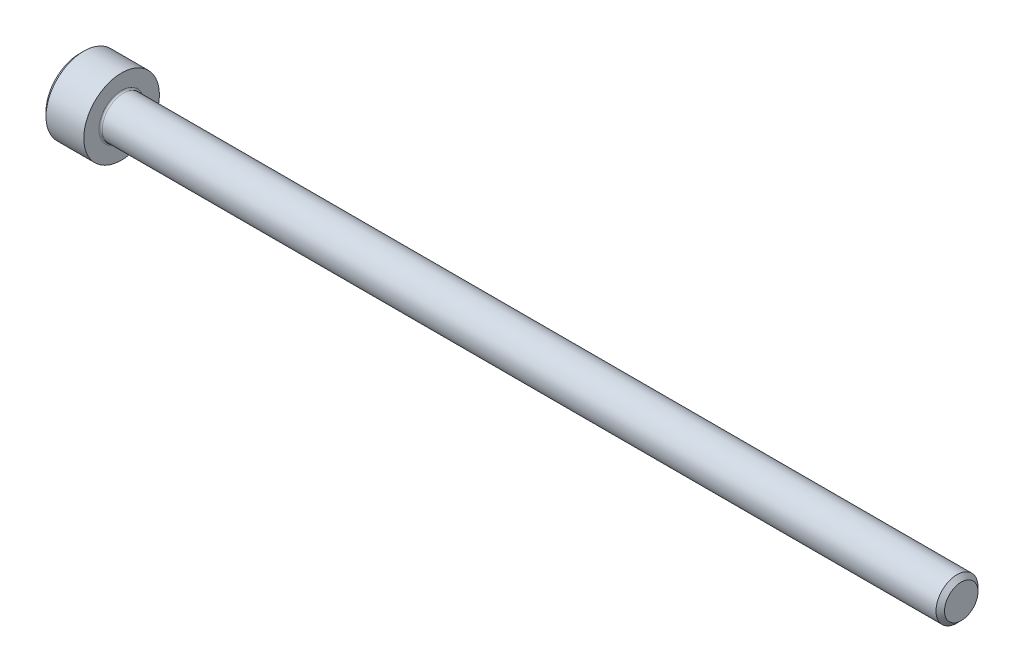
ISO-10303-21;
HEADER;
FILE_DESCRIPTION(('STEP AP214'),'2;1');
FILE_NAME('part.step','',(''),(''),'','','');
FILE_SCHEMA(('AUTOMOTIVE_DESIGN { 1 0 10303 214 1 1 1 1 }'));
ENDSEC;
DATA;
#1=APPLICATION_CONTEXT('core data for automotive mechanical design processes');
#2=APPLICATION_PROTOCOL_DEFINITION('international standard','automotive_design',2000,#1);
#3=PRODUCT_CONTEXT('',#1,'mechanical');
#4=PRODUCT('Part','Part','',(#3));
#5=PRODUCT_RELATED_PRODUCT_CATEGORY('part','',(#4));
#6=PRODUCT_DEFINITION_FORMATION('','',#4);
#7=PRODUCT_DEFINITION_CONTEXT('part definition',#1,'design');
#8=PRODUCT_DEFINITION('design','',#6,#7);
#9=PRODUCT_DEFINITION_SHAPE('','',#8);
#10=(LENGTH_UNIT() NAMED_UNIT(*) SI_UNIT(.MILLI.,.METRE.));
#11=(NAMED_UNIT(*) PLANE_ANGLE_UNIT() SI_UNIT($,.RADIAN.));
#12=(NAMED_UNIT(*) SI_UNIT($,.STERADIAN.) SOLID_ANGLE_UNIT());
#13=UNCERTAINTY_MEASURE_WITH_UNIT(LENGTH_MEASURE(1.E-05),#10,'distance_accuracy_value','');
#14=(GEOMETRIC_REPRESENTATION_CONTEXT(3) GLOBAL_UNCERTAINTY_ASSIGNED_CONTEXT((#13)) GLOBAL_UNIT_ASSIGNED_CONTEXT((#10,
#11,#12)) REPRESENTATION_CONTEXT('',''));
#15=CARTESIAN_POINT('',(0.,0.,0.));
#16=DIRECTION('',(0.,0.,1.));
#17=DIRECTION('',(1.,0.,0.));
#18=AXIS2_PLACEMENT_3D('',#15,#16,#17);
#19=CARTESIAN_POINT('',(0.,0.,0.));
#20=DIRECTION('',(-1.,0.,0.));
#21=DIRECTION('',(0.,0.,1.));
#22=AXIS2_PLACEMENT_3D('',#19,#20,#21);
#23=PLANE('',#22);
#24=DIRECTION('',(0.,-0.5,0.866025403784439));
#25=VECTOR('',#24,1.);
#26=CARTESIAN_POINT('',(0.,1.18068130049278,0.));
#27=LINE('',#26,#25);
#28=CARTESIAN_POINT('',(0.,1.18068130049278,0.));
#29=VERTEX_POINT('',#28);
#30=CARTESIAN_POINT('',(0.,0.590340650246392,1.0225));
#31=VERTEX_POINT('',#30);
#32=EDGE_CURVE('E266',#29,#31,#27,.T.);
#33=ORIENTED_EDGE('',*,*,#32,.T.);
#34=DIRECTION('',(0.,1.,0.));
#35=VECTOR('',#34,1.);
#36=CARTESIAN_POINT('',(0.,-0.590340650246393,1.0225));
#37=LINE('',#36,#35);
#38=CARTESIAN_POINT('',(0.,-0.590340650246393,1.0225));
#39=VERTEX_POINT('',#38);
#40=EDGE_CURVE('E137',#39,#31,#37,.T.);
#41=ORIENTED_EDGE('',*,*,#40,.F.);
#42=DIRECTION('',(0.,-0.500000000000001,-0.866025403784438));
#43=VECTOR('',#42,1.);
#44=CARTESIAN_POINT('',(0.,-0.590340650246393,1.0225));
#45=LINE('',#44,#43);
#46=CARTESIAN_POINT('',(0.,-1.18068130049279,0.));
#47=VERTEX_POINT('',#46);
#48=EDGE_CURVE('E269',#39,#47,#45,.T.);
#49=ORIENTED_EDGE('',*,*,#48,.T.);
#50=DIRECTION('',(0.,0.5,-0.866025403784439));
#51=VECTOR('',#50,1.);
#52=CARTESIAN_POINT('',(0.,-1.18068130049279,0.));
#53=LINE('',#52,#51);
#54=CARTESIAN_POINT('',(0.,-0.590340650246394,-1.0225));
#55=VERTEX_POINT('',#54);
#56=EDGE_CURVE('E272',#47,#55,#53,.T.);
#57=ORIENTED_EDGE('',*,*,#56,.T.);
#58=DIRECTION('',(0.,-1.,0.));
#59=VECTOR('',#58,1.);
#60=CARTESIAN_POINT('',(0.,0.590340650246391,-1.0225));
#61=LINE('',#60,#59);
#62=CARTESIAN_POINT('',(0.,0.590340650246391,-1.0225));
#63=VERTEX_POINT('',#62);
#64=EDGE_CURVE('E275',#63,#55,#61,.T.);
#65=ORIENTED_EDGE('',*,*,#64,.F.);
#66=DIRECTION('',(0.,-0.500000000000001,-0.866025403784438));
#67=VECTOR('',#66,1.);
#68=CARTESIAN_POINT('',(0.,1.18068130049278,0.));
#69=LINE('',#68,#67);
#70=EDGE_CURVE('E132',#29,#63,#69,.T.);
#71=ORIENTED_EDGE('',*,*,#70,.F.);
#72=EDGE_LOOP('',(#33,#41,#49,#57,#65,#71));
#73=FACE_BOUND('',#72,.T.);
#74=CARTESIAN_POINT('',(0.,0.,0.));
#75=DIRECTION('',(-1.,0.,0.));
#76=DIRECTION('',(0.,0.,1.));
#77=AXIS2_PLACEMENT_3D('',#74,#75,#76);
#78=CIRCLE('',#77,2.);
#79=CARTESIAN_POINT('',(0.,0.,2.));
#80=VERTEX_POINT('',#79);
#81=EDGE_CURVE('E161',#80,#80,#78,.T.);
#82=ORIENTED_EDGE('',*,*,#81,.T.);
#83=EDGE_LOOP('',(#82));
#84=FACE_BOUND('',#83,.T.);
#85=ADVANCED_FACE('F41',(#73,#84),#23,.T.);
#86=CARTESIAN_POINT('',(0.,0.,0.));
#87=DIRECTION('',(1.,0.,0.));
#88=DIRECTION('',(0.,0.,-1.));
#89=AXIS2_PLACEMENT_3D('',#86,#87,#88);
#90=CONICAL_SURFACE('',#89,2.,0.785398163397448);
#91=CARTESIAN_POINT('',(0.25,0.,0.));
#92=DIRECTION('',(-1.,0.,0.));
#93=DIRECTION('',(0.,0.,1.));
#94=AXIS2_PLACEMENT_3D('',#91,#92,#93);
#95=CIRCLE('',#94,2.25);
#96=CARTESIAN_POINT('',(0.25,0.,2.25));
#97=VERTEX_POINT('',#96);
#98=EDGE_CURVE('E158',#97,#97,#95,.T.);
#99=ORIENTED_EDGE('',*,*,#98,.T.);
#100=EDGE_LOOP('',(#99));
#101=FACE_BOUND('',#100,.T.);
#102=ORIENTED_EDGE('',*,*,#81,.F.);
#103=EDGE_LOOP('',(#102));
#104=FACE_BOUND('',#103,.T.);
#105=ADVANCED_FACE('F182',(#101,#104),#90,.T.);
#106=CARTESIAN_POINT('',(-31.75,0.,0.));
#107=DIRECTION('',(-1.,0.,0.));
#108=DIRECTION('',(0.,0.,1.));
#109=AXIS2_PLACEMENT_3D('',#106,#107,#108);
#110=CYLINDRICAL_SURFACE('',#109,2.25);
#111=CARTESIAN_POINT('',(2.5,0.,0.));
#112=DIRECTION('',(-1.,0.,0.));
#113=DIRECTION('',(0.,0.,1.));
#114=AXIS2_PLACEMENT_3D('',#111,#112,#113);
#115=CIRCLE('',#114,2.25);
#116=CARTESIAN_POINT('',(2.5,0.,2.25));
#117=VERTEX_POINT('',#116);
#118=EDGE_CURVE('E155',#117,#117,#115,.T.);
#119=ORIENTED_EDGE('',*,*,#118,.T.);
#120=EDGE_LOOP('',(#119));
#121=FACE_BOUND('',#120,.T.);
#122=ORIENTED_EDGE('',*,*,#98,.F.);
#123=EDGE_LOOP('',(#122));
#124=FACE_BOUND('',#123,.T.);
#125=ADVANCED_FACE('F187',(#121,#124),#110,.T.);
#126=CARTESIAN_POINT('',(2.5,2.25,0.));
#127=DIRECTION('',(1.,0.,0.));
#128=DIRECTION('',(0.,0.,-1.));
#129=AXIS2_PLACEMENT_3D('',#126,#127,#128);
#130=PLANE('',#129);
#131=CARTESIAN_POINT('',(2.5,0.,0.));
#132=DIRECTION('',(1.,0.,0.));
#133=DIRECTION('',(0.,0.,-1.));
#134=AXIS2_PLACEMENT_3D('',#131,#132,#133);
#135=CIRCLE('',#134,1.35);
#136=CARTESIAN_POINT('',(2.5,0.,-1.35));
#137=VERTEX_POINT('',#136);
#138=EDGE_CURVE('E49',#137,#137,#135,.F.);
#139=ORIENTED_EDGE('',*,*,#138,.T.);
#140=EDGE_LOOP('',(#139));
#141=FACE_BOUND('',#140,.T.);
#142=ORIENTED_EDGE('',*,*,#118,.F.);
#143=EDGE_LOOP('',(#142));
#144=FACE_BOUND('',#143,.T.);
#145=ADVANCED_FACE('F166',(#141,#144),#130,.T.);
#146=CARTESIAN_POINT('',(-31.75,0.,0.));
#147=DIRECTION('',(-1.,0.,0.));
#148=DIRECTION('',(0.,0.,1.));
#149=AXIS2_PLACEMENT_3D('',#146,#147,#148);
#150=CYLINDRICAL_SURFACE('',#149,1.25);
#151=CARTESIAN_POINT('',(2.6,0.,0.));
#152=DIRECTION('',(1.,0.,0.));
#153=DIRECTION('',(0.,0.,-1.));
#154=AXIS2_PLACEMENT_3D('',#151,#152,#153);
#155=CIRCLE('',#154,1.25);
#156=CARTESIAN_POINT('',(2.6,0.,-1.25));
#157=VERTEX_POINT('',#156);
#158=EDGE_CURVE('E11',#157,#157,#155,.T.);
#159=ORIENTED_EDGE('',*,*,#158,.T.);
#160=EDGE_LOOP('',(#159));
#161=FACE_BOUND('',#160,.T.);
#162=CARTESIAN_POINT('',(52.2465,0.,0.));
#163=DIRECTION('',(-1.,0.,0.));
#164=DIRECTION('',(0.,0.,1.));
#165=AXIS2_PLACEMENT_3D('',#162,#163,#164);
#166=CIRCLE('',#165,1.25);
#167=CARTESIAN_POINT('',(52.2465,0.,1.25));
#168=VERTEX_POINT('',#167);
#169=EDGE_CURVE('E152',#168,#168,#166,.T.);
#170=ORIENTED_EDGE('',*,*,#169,.T.);
#171=EDGE_LOOP('',(#170));
#172=FACE_BOUND('',#171,.T.);
#173=ADVANCED_FACE('F197',(#161,#172),#150,.T.);
#174=CARTESIAN_POINT('',(52.5,0.,0.));
#175=DIRECTION('',(-1.,0.,0.));
#176=DIRECTION('',(0.,0.,1.));
#177=AXIS2_PLACEMENT_3D('',#174,#175,#176);
#178=CONICAL_SURFACE('',#177,0.9965,0.785398163397497);
#179=ORIENTED_EDGE('',*,*,#169,.F.);
#180=EDGE_LOOP('',(#179));
#181=FACE_BOUND('',#180,.T.);
#182=CARTESIAN_POINT('',(52.5,0.,0.));
#183=DIRECTION('',(-1.,0.,0.));
#184=DIRECTION('',(0.,0.,1.));
#185=AXIS2_PLACEMENT_3D('',#182,#183,#184);
#186=CIRCLE('',#185,0.9965);
#187=CARTESIAN_POINT('',(52.5,0.,0.9965));
#188=VERTEX_POINT('',#187);
#189=EDGE_CURVE('E148',#188,#188,#186,.T.);
#190=ORIENTED_EDGE('',*,*,#189,.T.);
#191=EDGE_LOOP('',(#190));
#192=FACE_BOUND('',#191,.T.);
#193=ADVANCED_FACE('F177',(#181,#192),#178,.T.);
#194=CARTESIAN_POINT('',(52.5,0.9965,0.));
#195=DIRECTION('',(1.,0.,0.));
#196=DIRECTION('',(0.,0.,-1.));
#197=AXIS2_PLACEMENT_3D('',#194,#195,#196);
#198=PLANE('',#197);
#199=ORIENTED_EDGE('',*,*,#189,.F.);
#200=EDGE_LOOP('',(#199));
#201=FACE_BOUND('',#200,.T.);
#202=ADVANCED_FACE('F170',(#201),#198,.T.);
#203=CARTESIAN_POINT('',(2.6,0.,0.));
#204=DIRECTION('',(1.,0.,0.));
#205=DIRECTION('',(0.,0.,-1.));
#206=AXIS2_PLACEMENT_3D('',#203,#204,#205);
#207=TOROIDAL_SURFACE('',#206,1.35,0.1);
#208=ORIENTED_EDGE('',*,*,#158,.F.);
#209=EDGE_LOOP('',(#208));
#210=FACE_BOUND('',#209,.T.);
#211=ORIENTED_EDGE('',*,*,#138,.F.);
#212=EDGE_LOOP('',(#211));
#213=FACE_BOUND('',#212,.T.);
#214=ADVANCED_FACE('F43',(#210,#213),#207,.F.);
#215=CARTESIAN_POINT('',(1.1,1.18068130049278,0.));
#216=DIRECTION('',(0.,-0.866025403784438,-0.5));
#217=DIRECTION('',(0.,0.5,-0.866025403784438));
#218=AXIS2_PLACEMENT_3D('',#215,#216,#217);
#219=PLANE('',#218);
#220=ORIENTED_EDGE('',*,*,#32,.F.);
#221=DIRECTION('',(-1.,0.,0.));
#222=VECTOR('',#221,1.);
#223=CARTESIAN_POINT('',(1.1,1.18068130049278,0.));
#224=LINE('',#223,#222);
#225=CARTESIAN_POINT('',(1.1,1.18068130049278,0.));
#226=VERTEX_POINT('',#225);
#227=EDGE_CURVE('E256',#226,#29,#224,.T.);
#228=ORIENTED_EDGE('',*,*,#227,.F.);
#229=DIRECTION('',(0.,-0.5,0.866025403784439));
#230=VECTOR('',#229,1.);
#231=CARTESIAN_POINT('',(1.1,1.18068130049278,0.));
#232=LINE('',#231,#230);
#233=CARTESIAN_POINT('',(1.1,0.885510975369588,0.51125));
#234=VERTEX_POINT('',#233);
#235=EDGE_CURVE('E124',#226,#234,#232,.T.);
#236=ORIENTED_EDGE('',*,*,#235,.T.);
#237=CARTESIAN_POINT('',(1.1,0.590340650246392,1.0225));
#238=VERTEX_POINT('',#237);
#239=EDGE_CURVE('E115',#234,#238,#232,.T.);
#240=ORIENTED_EDGE('',*,*,#239,.T.);
#241=DIRECTION('',(-1.,0.,0.));
#242=VECTOR('',#241,1.);
#243=CARTESIAN_POINT('',(1.1,0.590340650246392,1.0225));
#244=LINE('',#243,#242);
#245=EDGE_CURVE('E129',#238,#31,#244,.T.);
#246=ORIENTED_EDGE('',*,*,#245,.T.);
#247=EDGE_LOOP('',(#220,#228,#236,#240,#246));
#248=FACE_BOUND('',#247,.T.);
#249=ADVANCED_FACE('F128',(#248),#219,.T.);
#250=CARTESIAN_POINT('',(1.1,-0.590340650246393,1.0225));
#251=DIRECTION('',(0.,0.,1.));
#252=DIRECTION('',(0.,-1.,0.));
#253=AXIS2_PLACEMENT_3D('',#250,#251,#252);
#254=PLANE('',#253);
#255=ORIENTED_EDGE('',*,*,#40,.T.);
#256=ORIENTED_EDGE('',*,*,#245,.F.);
#257=DIRECTION('',(0.,1.,0.));
#258=VECTOR('',#257,1.);
#259=CARTESIAN_POINT('',(1.1,-0.590340650246393,1.0225));
#260=LINE('',#259,#258);
#261=CARTESIAN_POINT('',(1.1,0.,1.0225));
#262=VERTEX_POINT('',#261);
#263=EDGE_CURVE('E112',#262,#238,#260,.T.);
#264=ORIENTED_EDGE('',*,*,#263,.F.);
#265=CARTESIAN_POINT('',(1.1,-0.590340650246393,1.0225));
#266=VERTEX_POINT('',#265);
#267=EDGE_CURVE('E123',#266,#262,#260,.T.);
#268=ORIENTED_EDGE('',*,*,#267,.F.);
#269=DIRECTION('',(-1.,0.,0.));
#270=VECTOR('',#269,1.);
#271=CARTESIAN_POINT('',(1.1,-0.590340650246393,1.0225));
#272=LINE('',#271,#270);
#273=EDGE_CURVE('E139',#266,#39,#272,.T.);
#274=ORIENTED_EDGE('',*,*,#273,.T.);
#275=EDGE_LOOP('',(#255,#256,#264,#268,#274));
#276=FACE_BOUND('',#275,.T.);
#277=ADVANCED_FACE('F134',(#276),#254,.F.);
#278=CARTESIAN_POINT('',(1.1,-0.590340650246393,1.0225));
#279=DIRECTION('',(0.,0.866025403784438,-0.500000000000001));
#280=DIRECTION('',(0.,0.500000000000001,0.866025403784438));
#281=AXIS2_PLACEMENT_3D('',#278,#279,#280);
#282=PLANE('',#281);
#283=ORIENTED_EDGE('',*,*,#48,.F.);
#284=ORIENTED_EDGE('',*,*,#273,.F.);
#285=DIRECTION('',(0.,-0.500000000000001,-0.866025403784438));
#286=VECTOR('',#285,1.);
#287=CARTESIAN_POINT('',(1.1,-0.590340650246393,1.0225));
#288=LINE('',#287,#286);
#289=CARTESIAN_POINT('',(1.1,-0.885510975369589,0.511250000000002));
#290=VERTEX_POINT('',#289);
#291=EDGE_CURVE('E295',#266,#290,#288,.T.);
#292=ORIENTED_EDGE('',*,*,#291,.T.);
#293=CARTESIAN_POINT('',(1.1,-1.18068130049279,0.));
#294=VERTEX_POINT('',#293);
#295=EDGE_CURVE('E284',#290,#294,#288,.T.);
#296=ORIENTED_EDGE('',*,*,#295,.T.);
#297=DIRECTION('',(-1.,0.,0.));
#298=VECTOR('',#297,1.);
#299=CARTESIAN_POINT('',(1.1,-1.18068130049279,0.));
#300=LINE('',#299,#298);
#301=EDGE_CURVE('E144',#294,#47,#300,.T.);
#302=ORIENTED_EDGE('',*,*,#301,.T.);
#303=EDGE_LOOP('',(#283,#284,#292,#296,#302));
#304=FACE_BOUND('',#303,.T.);
#305=ADVANCED_FACE('F210',(#304),#282,.T.);
#306=CARTESIAN_POINT('',(1.1,-1.18068130049279,0.));
#307=DIRECTION('',(0.,0.866025403784438,0.5));
#308=DIRECTION('',(0.,-0.5,0.866025403784439));
#309=AXIS2_PLACEMENT_3D('',#306,#307,#308);
#310=PLANE('',#309);
#311=ORIENTED_EDGE('',*,*,#56,.F.);
#312=ORIENTED_EDGE('',*,*,#301,.F.);
#313=DIRECTION('',(0.,0.5,-0.866025403784439));
#314=VECTOR('',#313,1.);
#315=CARTESIAN_POINT('',(1.1,-1.18068130049279,0.));
#316=LINE('',#315,#314);
#317=CARTESIAN_POINT('',(1.1,-0.88551097536959,-0.511250000000001));
#318=VERTEX_POINT('',#317);
#319=EDGE_CURVE('E262',#294,#318,#316,.T.);
#320=ORIENTED_EDGE('',*,*,#319,.T.);
#321=CARTESIAN_POINT('',(1.1,-0.590340650246394,-1.0225));
#322=VERTEX_POINT('',#321);
#323=EDGE_CURVE('E294',#318,#322,#316,.T.);
#324=ORIENTED_EDGE('',*,*,#323,.T.);
#325=DIRECTION('',(-1.,0.,0.));
#326=VECTOR('',#325,1.);
#327=CARTESIAN_POINT('',(1.1,-0.590340650246394,-1.0225));
#328=LINE('',#327,#326);
#329=EDGE_CURVE('E255',#322,#55,#328,.T.);
#330=ORIENTED_EDGE('',*,*,#329,.T.);
#331=EDGE_LOOP('',(#311,#312,#320,#324,#330));
#332=FACE_BOUND('',#331,.T.);
#333=ADVANCED_FACE('F213',(#332),#310,.T.);
#334=CARTESIAN_POINT('',(1.1,0.590340650246391,-1.0225));
#335=DIRECTION('',(0.,0.,-1.));
#336=DIRECTION('',(0.,1.,0.));
#337=AXIS2_PLACEMENT_3D('',#334,#335,#336);
#338=PLANE('',#337);
#339=ORIENTED_EDGE('',*,*,#64,.T.);
#340=ORIENTED_EDGE('',*,*,#329,.F.);
#341=DIRECTION('',(0.,-1.,0.));
#342=VECTOR('',#341,1.);
#343=CARTESIAN_POINT('',(1.1,0.590340650246391,-1.0225));
#344=LINE('',#343,#342);
#345=CARTESIAN_POINT('',(1.1,0.,-1.0225));
#346=VERTEX_POINT('',#345);
#347=EDGE_CURVE('E259',#346,#322,#344,.T.);
#348=ORIENTED_EDGE('',*,*,#347,.F.);
#349=CARTESIAN_POINT('',(1.1,0.590340650246391,-1.0225));
#350=VERTEX_POINT('',#349);
#351=EDGE_CURVE('E56',#350,#346,#344,.T.);
#352=ORIENTED_EDGE('',*,*,#351,.F.);
#353=DIRECTION('',(-1.,0.,0.));
#354=VECTOR('',#353,1.);
#355=CARTESIAN_POINT('',(1.1,0.590340650246391,-1.0225));
#356=LINE('',#355,#354);
#357=EDGE_CURVE('E252',#350,#63,#356,.T.);
#358=ORIENTED_EDGE('',*,*,#357,.T.);
#359=EDGE_LOOP('',(#339,#340,#348,#352,#358));
#360=FACE_BOUND('',#359,.T.);
#361=ADVANCED_FACE('F217',(#360),#338,.F.);
#362=CARTESIAN_POINT('',(1.1,1.18068130049278,0.));
#363=DIRECTION('',(0.,0.866025403784438,-0.500000000000001));
#364=DIRECTION('',(0.,0.500000000000001,0.866025403784438));
#365=AXIS2_PLACEMENT_3D('',#362,#363,#364);
#366=PLANE('',#365);
#367=ORIENTED_EDGE('',*,*,#70,.T.);
#368=ORIENTED_EDGE('',*,*,#357,.F.);
#369=DIRECTION('',(0.,-0.500000000000001,-0.866025403784438));
#370=VECTOR('',#369,1.);
#371=CARTESIAN_POINT('',(1.1,1.18068130049278,0.));
#372=LINE('',#371,#370);
#373=CARTESIAN_POINT('',(1.1,0.885510975369588,-0.511250000000001));
#374=VERTEX_POINT('',#373);
#375=EDGE_CURVE('E242',#374,#350,#372,.T.);
#376=ORIENTED_EDGE('',*,*,#375,.F.);
#377=EDGE_CURVE('E248',#226,#374,#372,.T.);
#378=ORIENTED_EDGE('',*,*,#377,.F.);
#379=ORIENTED_EDGE('',*,*,#227,.T.);
#380=EDGE_LOOP('',(#367,#368,#376,#378,#379));
#381=FACE_BOUND('',#380,.T.);
#382=ADVANCED_FACE('F221',(#381),#366,.F.);
#383=CARTESIAN_POINT('',(1.1,1.18068130049278,0.));
#384=DIRECTION('',(1.,0.,0.));
#385=DIRECTION('',(0.,0.,-1.));
#386=AXIS2_PLACEMENT_3D('',#383,#384,#385);
#387=PLANE('',#386);
#388=ORIENTED_EDGE('',*,*,#347,.T.);
#389=ORIENTED_EDGE('',*,*,#323,.F.);
#390=CARTESIAN_POINT('',(1.1,0.,0.));
#391=DIRECTION('',(-1.,0.,0.));
#392=DIRECTION('',(0.,0.,1.));
#393=AXIS2_PLACEMENT_3D('',#390,#391,#392);
#394=CIRCLE('',#393,1.0225);
#395=EDGE_CURVE('E290',#346,#318,#394,.T.);
#396=ORIENTED_EDGE('',*,*,#395,.F.);
#397=EDGE_LOOP('',(#388,#389,#396));
#398=FACE_BOUND('',#397,.T.);
#399=ADVANCED_FACE('F225',(#398),#387,.F.);
#400=ORIENTED_EDGE('',*,*,#319,.F.);
#401=ORIENTED_EDGE('',*,*,#295,.F.);
#402=EDGE_CURVE('E142',#318,#290,#394,.T.);
#403=ORIENTED_EDGE('',*,*,#402,.F.);
#404=EDGE_LOOP('',(#400,#401,#403));
#405=FACE_BOUND('',#404,.T.);
#406=ADVANCED_FACE('F228',(#405),#387,.F.);
#407=ORIENTED_EDGE('',*,*,#291,.F.);
#408=ORIENTED_EDGE('',*,*,#267,.T.);
#409=EDGE_CURVE('E138',#290,#262,#394,.T.);
#410=ORIENTED_EDGE('',*,*,#409,.F.);
#411=EDGE_LOOP('',(#407,#408,#410));
#412=FACE_BOUND('',#411,.T.);
#413=ADVANCED_FACE('F233',(#412),#387,.F.);
#414=ORIENTED_EDGE('',*,*,#263,.T.);
#415=ORIENTED_EDGE('',*,*,#239,.F.);
#416=EDGE_CURVE('E118',#262,#234,#394,.T.);
#417=ORIENTED_EDGE('',*,*,#416,.F.);
#418=EDGE_LOOP('',(#414,#415,#417));
#419=FACE_BOUND('',#418,.T.);
#420=ADVANCED_FACE('F114',(#419),#387,.F.);
#421=ORIENTED_EDGE('',*,*,#235,.F.);
#422=ORIENTED_EDGE('',*,*,#377,.T.);
#423=EDGE_CURVE('E149',#234,#374,#394,.T.);
#424=ORIENTED_EDGE('',*,*,#423,.F.);
#425=EDGE_LOOP('',(#421,#422,#424));
#426=FACE_BOUND('',#425,.T.);
#427=ADVANCED_FACE('F236',(#426),#387,.F.);
#428=ORIENTED_EDGE('',*,*,#375,.T.);
#429=ORIENTED_EDGE('',*,*,#351,.T.);
#430=EDGE_CURVE('E245',#374,#346,#394,.T.);
#431=ORIENTED_EDGE('',*,*,#430,.F.);
#432=EDGE_LOOP('',(#428,#429,#431));
#433=FACE_BOUND('',#432,.T.);
#434=ADVANCED_FACE('F206',(#433),#387,.F.);
#435=CARTESIAN_POINT('',(1.1,0.,0.));
#436=DIRECTION('',(-1.,0.,0.));
#437=DIRECTION('',(0.,0.,1.));
#438=AXIS2_PLACEMENT_3D('',#435,#436,#437);
#439=CONICAL_SURFACE('',#438,1.0225,1.04719755119659);
#440=CARTESIAN_POINT('',(1.6903406502464,0.,0.));
#441=VERTEX_POINT('',#440);
#442=VERTEX_LOOP('',#441);
#443=FACE_BOUND('',#442,.T.);
#444=ORIENTED_EDGE('',*,*,#416,.T.);
#445=ORIENTED_EDGE('',*,*,#423,.T.);
#446=ORIENTED_EDGE('',*,*,#430,.T.);
#447=ORIENTED_EDGE('',*,*,#395,.T.);
#448=ORIENTED_EDGE('',*,*,#402,.T.);
#449=ORIENTED_EDGE('',*,*,#409,.T.);
#450=EDGE_LOOP('',(#444,#445,#446,#447,#448,#449));
#451=FACE_BOUND('',#450,.T.);
#452=ADVANCED_FACE('F204',(#443,#451),#439,.F.);
#453=CLOSED_SHELL('',(#85,#105,#125,#145,#173,#193,#202,#214,#249,#277,#305,#333,#361,#382,#399,
#406,#413,#420,#427,#434,#452));
#454=MANIFOLD_SOLID_BREP('B2',#453);
#455=ADVANCED_BREP_SHAPE_REPRESENTATION('',(#18,#454),#14);
#456=SHAPE_DEFINITION_REPRESENTATION(#9,#455);
ENDSEC;
END-ISO-10303-21;
